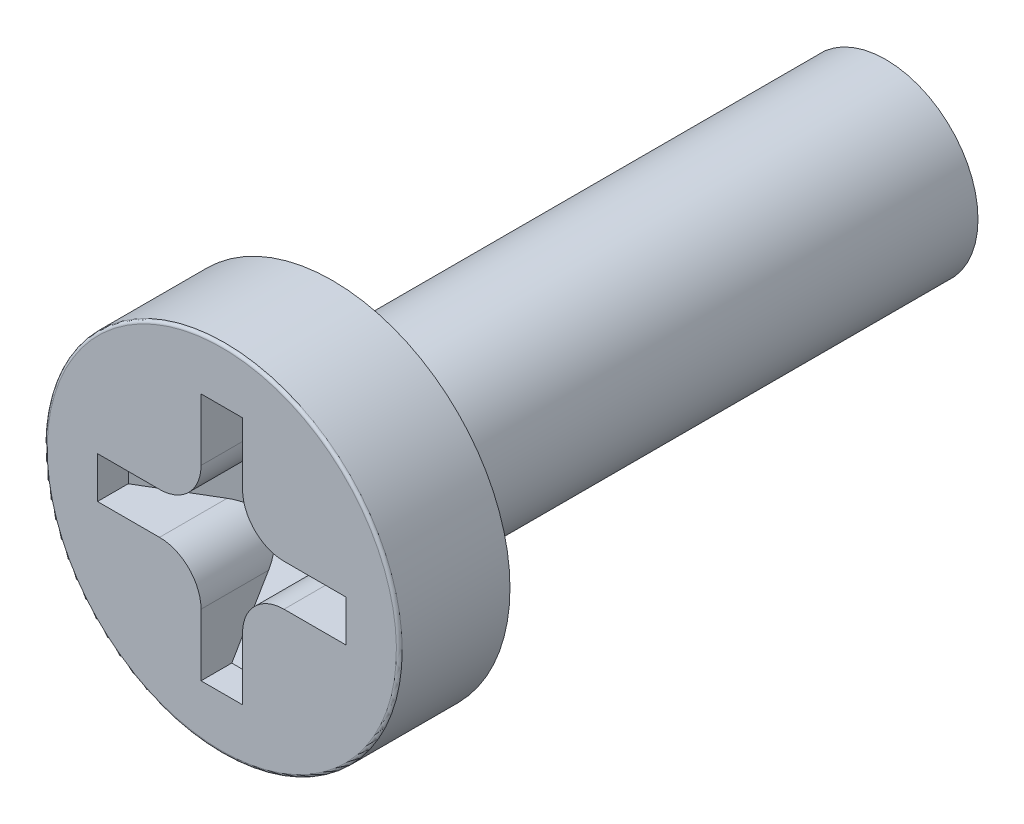
ISO-10303-21;
HEADER;
FILE_DESCRIPTION(('STEP AP214'),'2;1');
FILE_NAME('part.step','',(''),(''),'','','');
FILE_SCHEMA(('AUTOMOTIVE_DESIGN { 1 0 10303 214 1 1 1 1 }'));
ENDSEC;
DATA;
#1=APPLICATION_CONTEXT('core data for automotive mechanical design processes');
#2=APPLICATION_PROTOCOL_DEFINITION('international standard','automotive_design',2000,#1);
#3=PRODUCT_CONTEXT('',#1,'mechanical');
#4=PRODUCT('Part','Part','',(#3));
#5=PRODUCT_RELATED_PRODUCT_CATEGORY('part','',(#4));
#6=PRODUCT_DEFINITION_FORMATION('','',#4);
#7=PRODUCT_DEFINITION_CONTEXT('part definition',#1,'design');
#8=PRODUCT_DEFINITION('design','',#6,#7);
#9=PRODUCT_DEFINITION_SHAPE('','',#8);
#10=(LENGTH_UNIT() NAMED_UNIT(*) SI_UNIT(.MILLI.,.METRE.));
#11=(NAMED_UNIT(*) PLANE_ANGLE_UNIT() SI_UNIT($,.RADIAN.));
#12=(NAMED_UNIT(*) SI_UNIT($,.STERADIAN.) SOLID_ANGLE_UNIT());
#13=UNCERTAINTY_MEASURE_WITH_UNIT(LENGTH_MEASURE(1.E-05),#10,'distance_accuracy_value','');
#14=(GEOMETRIC_REPRESENTATION_CONTEXT(3) GLOBAL_UNCERTAINTY_ASSIGNED_CONTEXT((#13)) GLOBAL_UNIT_ASSIGNED_CONTEXT((#10,
#11,#12)) REPRESENTATION_CONTEXT('',''));
#15=CARTESIAN_POINT('',(0.,0.,0.));
#16=DIRECTION('',(0.,0.,1.));
#17=DIRECTION('',(1.,0.,0.));
#18=AXIS2_PLACEMENT_3D('',#15,#16,#17);
#19=CARTESIAN_POINT('',(0.,0.,0.2));
#20=DIRECTION('',(0.,0.,1.));
#21=DIRECTION('',(1.,0.,0.));
#22=AXIS2_PLACEMENT_3D('',#19,#20,#21);
#23=PLANE('',#22);
#24=DIRECTION('',(0.,1.,0.));
#25=VECTOR('',#24,1.);
#26=CARTESIAN_POINT('',(-0.45,-0.225,0.2));
#27=LINE('',#26,#25);
#28=CARTESIAN_POINT('',(-0.45,-0.285288568297004,0.2));
#29=VERTEX_POINT('',#28);
#30=CARTESIAN_POINT('',(-0.45,0.285288568297004,0.2));
#31=VERTEX_POINT('',#30);
#32=EDGE_CURVE('E303',#29,#31,#27,.T.);
#33=ORIENTED_EDGE('',*,*,#32,.F.);
#34=CARTESIAN_POINT('',(-0.675000000000003,-0.675,0.2));
#35=DIRECTION('',(0.,0.,1.));
#36=DIRECTION('',(1.,0.,0.));
#37=AXIS2_PLACEMENT_3D('',#34,#35,#36);
#38=CIRCLE('',#37,0.45);
#39=CARTESIAN_POINT('',(-0.285288568297005,-0.45,0.2));
#40=VERTEX_POINT('',#39);
#41=EDGE_CURVE('E383',#29,#40,#38,.F.);
#42=ORIENTED_EDGE('',*,*,#41,.T.);
#43=DIRECTION('',(-1.,0.,0.));
#44=VECTOR('',#43,1.);
#45=CARTESIAN_POINT('',(0.224999999999998,-0.45,0.2));
#46=LINE('',#45,#44);
#47=CARTESIAN_POINT('',(0.285288568297,-0.45,0.2));
#48=VERTEX_POINT('',#47);
#49=EDGE_CURVE('E58',#48,#40,#46,.T.);
#50=ORIENTED_EDGE('',*,*,#49,.F.);
#51=CARTESIAN_POINT('',(0.674999999999998,-0.675,0.2));
#52=DIRECTION('',(0.,0.,1.));
#53=DIRECTION('',(1.,0.,0.));
#54=AXIS2_PLACEMENT_3D('',#51,#52,#53);
#55=CIRCLE('',#54,0.45);
#56=CARTESIAN_POINT('',(0.45,-0.285288568297001,0.2));
#57=VERTEX_POINT('',#56);
#58=EDGE_CURVE('E355',#48,#57,#55,.F.);
#59=ORIENTED_EDGE('',*,*,#58,.T.);
#60=DIRECTION('',(0.,1.,0.));
#61=VECTOR('',#60,1.);
#62=CARTESIAN_POINT('',(0.45,-0.225,0.2));
#63=LINE('',#62,#61);
#64=CARTESIAN_POINT('',(0.45,0.285288568297001,0.2));
#65=VERTEX_POINT('',#64);
#66=EDGE_CURVE('E284',#57,#65,#63,.T.);
#67=ORIENTED_EDGE('',*,*,#66,.T.);
#68=CARTESIAN_POINT('',(0.674999999999998,0.675,0.2));
#69=DIRECTION('',(0.,0.,1.));
#70=DIRECTION('',(1.,0.,0.));
#71=AXIS2_PLACEMENT_3D('',#68,#69,#70);
#72=CIRCLE('',#71,0.45);
#73=CARTESIAN_POINT('',(0.285288568297,0.45,0.2));
#74=VERTEX_POINT('',#73);
#75=EDGE_CURVE('E343',#65,#74,#72,.F.);
#76=ORIENTED_EDGE('',*,*,#75,.T.);
#77=DIRECTION('',(-1.,0.,0.));
#78=VECTOR('',#77,1.);
#79=CARTESIAN_POINT('',(0.224999999999998,0.45,0.2));
#80=LINE('',#79,#78);
#81=CARTESIAN_POINT('',(-0.285288568297005,0.45,0.2));
#82=VERTEX_POINT('',#81);
#83=EDGE_CURVE('E273',#74,#82,#80,.T.);
#84=ORIENTED_EDGE('',*,*,#83,.T.);
#85=CARTESIAN_POINT('',(-0.675000000000003,0.675,0.2));
#86=DIRECTION('',(0.,0.,1.));
#87=DIRECTION('',(1.,0.,0.));
#88=AXIS2_PLACEMENT_3D('',#85,#86,#87);
#89=CIRCLE('',#88,0.45);
#90=EDGE_CURVE('E369',#82,#31,#89,.F.);
#91=ORIENTED_EDGE('',*,*,#90,.T.);
#92=EDGE_LOOP('',(#33,#42,#50,#59,#67,#76,#84,#91));
#93=FACE_BOUND('',#92,.T.);
#94=ADVANCED_FACE('F37',(#93),#23,.T.);
#95=CARTESIAN_POINT('',(0.224999999999998,-1.3475,0.2));
#96=DIRECTION('',(1.,0.,0.));
#97=DIRECTION('',(0.,0.,-1.));
#98=AXIS2_PLACEMENT_3D('',#95,#96,#97);
#99=PLANE('',#98);
#100=DIRECTION('',(0.,1.,0.));
#101=VECTOR('',#100,1.);
#102=CARTESIAN_POINT('',(0.224999999999998,-1.3475,1.2));
#103=LINE('',#102,#101);
#104=CARTESIAN_POINT('',(0.224999999999998,-1.3475,1.2));
#105=VERTEX_POINT('',#104);
#106=CARTESIAN_POINT('',(0.224999999999998,-0.675,1.2));
#107=VERTEX_POINT('',#106);
#108=EDGE_CURVE('E238',#105,#107,#103,.T.);
#109=ORIENTED_EDGE('',*,*,#108,.T.);
#110=DIRECTION('',(0.,0.,1.));
#111=VECTOR('',#110,1.);
#112=CARTESIAN_POINT('',(0.224999999999998,-0.675,0.2));
#113=LINE('',#112,#111);
#114=CARTESIAN_POINT('',(0.224999999999998,-0.675,0.467260579064592));
#115=VERTEX_POINT('',#114);
#116=EDGE_CURVE('E325',#107,#115,#113,.F.);
#117=ORIENTED_EDGE('',*,*,#116,.T.);
#118=DIRECTION('',(0.,0.859793442170624,-0.510641984956575));
#119=VECTOR('',#118,1.);
#120=CARTESIAN_POINT('',(0.224999999999998,-0.45,0.333630289532296));
#121=LINE('',#120,#119);
#122=CARTESIAN_POINT('',(0.224999999999998,-1.3475,0.866666666666674));
#123=VERTEX_POINT('',#122);
#124=EDGE_CURVE('E289',#115,#123,#121,.F.);
#125=ORIENTED_EDGE('',*,*,#124,.T.);
#126=DIRECTION('',(0.,0.,1.));
#127=VECTOR('',#126,1.);
#128=CARTESIAN_POINT('',(0.224999999999998,-1.3475,0.2));
#129=LINE('',#128,#127);
#130=EDGE_CURVE('E255',#123,#105,#129,.T.);
#131=ORIENTED_EDGE('',*,*,#130,.T.);
#132=EDGE_LOOP('',(#109,#117,#125,#131));
#133=FACE_BOUND('',#132,.T.);
#134=ADVANCED_FACE('F406',(#133),#99,.F.);
#135=CARTESIAN_POINT('',(-0.225000000000002,-1.3475,0.2));
#136=DIRECTION('',(0.,-1.,0.));
#137=DIRECTION('',(0.,0.,-1.));
#138=AXIS2_PLACEMENT_3D('',#135,#136,#137);
#139=PLANE('',#138);
#140=DIRECTION('',(1.,0.,0.));
#141=VECTOR('',#140,1.);
#142=CARTESIAN_POINT('',(0.224999999999998,-1.3475,0.866666666666674));
#143=LINE('',#142,#141);
#144=CARTESIAN_POINT('',(-0.225000000000002,-1.3475,0.866666666666674));
#145=VERTEX_POINT('',#144);
#146=EDGE_CURVE('E280',#123,#145,#143,.F.);
#147=ORIENTED_EDGE('',*,*,#146,.T.);
#148=DIRECTION('',(0.,0.,1.));
#149=VECTOR('',#148,1.);
#150=CARTESIAN_POINT('',(-0.225000000000002,-1.3475,0.2));
#151=LINE('',#150,#149);
#152=CARTESIAN_POINT('',(-0.225000000000002,-1.3475,1.2));
#153=VERTEX_POINT('',#152);
#154=EDGE_CURVE('E257',#145,#153,#151,.T.);
#155=ORIENTED_EDGE('',*,*,#154,.T.);
#156=DIRECTION('',(1.,0.,0.));
#157=VECTOR('',#156,1.);
#158=CARTESIAN_POINT('',(-0.225000000000002,-1.3475,1.2));
#159=LINE('',#158,#157);
#160=EDGE_CURVE('E235',#153,#105,#159,.T.);
#161=ORIENTED_EDGE('',*,*,#160,.T.);
#162=ORIENTED_EDGE('',*,*,#130,.F.);
#163=EDGE_LOOP('',(#147,#155,#161,#162));
#164=FACE_BOUND('',#163,.T.);
#165=ADVANCED_FACE('F400',(#164),#139,.F.);
#166=CARTESIAN_POINT('',(-0.225000000000002,-0.225,0.2));
#167=DIRECTION('',(-1.,0.,0.));
#168=DIRECTION('',(0.,0.,1.));
#169=AXIS2_PLACEMENT_3D('',#166,#167,#168);
#170=PLANE('',#169);
#171=DIRECTION('',(0.,0.859793442170624,-0.510641984956575));
#172=VECTOR('',#171,1.);
#173=CARTESIAN_POINT('',(-0.225000000000002,-0.225,0.2));
#174=LINE('',#173,#172);
#175=CARTESIAN_POINT('',(-0.225000000000002,-0.675,0.467260579064591));
#176=VERTEX_POINT('',#175);
#177=EDGE_CURVE('E287',#176,#145,#174,.F.);
#178=ORIENTED_EDGE('',*,*,#177,.F.);
#179=DIRECTION('',(0.,0.,1.));
#180=VECTOR('',#179,1.);
#181=CARTESIAN_POINT('',(-0.225000000000002,-0.675,0.2));
#182=LINE('',#181,#180);
#183=CARTESIAN_POINT('',(-0.225000000000002,-0.675,1.2));
#184=VERTEX_POINT('',#183);
#185=EDGE_CURVE('E332',#176,#184,#182,.T.);
#186=ORIENTED_EDGE('',*,*,#185,.T.);
#187=DIRECTION('',(0.,-1.,0.));
#188=VECTOR('',#187,1.);
#189=CARTESIAN_POINT('',(-0.225000000000002,-0.225,1.2));
#190=LINE('',#189,#188);
#191=EDGE_CURVE('E233',#184,#153,#190,.T.);
#192=ORIENTED_EDGE('',*,*,#191,.T.);
#193=ORIENTED_EDGE('',*,*,#154,.F.);
#194=EDGE_LOOP('',(#178,#186,#192,#193));
#195=FACE_BOUND('',#194,.T.);
#196=ADVANCED_FACE('F396',(#195),#170,.F.);
#197=CARTESIAN_POINT('',(1.3475,0.225,0.2));
#198=DIRECTION('',(0.,1.,0.));
#199=DIRECTION('',(0.,0.,1.));
#200=AXIS2_PLACEMENT_3D('',#197,#198,#199);
#201=PLANE('',#200);
#202=DIRECTION('',(-1.,0.,0.));
#203=VECTOR('',#202,1.);
#204=CARTESIAN_POINT('',(1.3475,0.225,1.2));
#205=LINE('',#204,#203);
#206=CARTESIAN_POINT('',(1.3475,0.225,1.2));
#207=VERTEX_POINT('',#206);
#208=CARTESIAN_POINT('',(0.674999999999998,0.225,1.2));
#209=VERTEX_POINT('',#208);
#210=EDGE_CURVE('E246',#207,#209,#205,.T.);
#211=ORIENTED_EDGE('',*,*,#210,.T.);
#212=DIRECTION('',(0.,0.,1.));
#213=VECTOR('',#212,1.);
#214=CARTESIAN_POINT('',(0.674999999999998,0.225,0.2));
#215=LINE('',#214,#213);
#216=CARTESIAN_POINT('',(0.674999999999997,0.225,0.467260579064588));
#217=VERTEX_POINT('',#216);
#218=EDGE_CURVE('E320',#209,#217,#215,.F.);
#219=ORIENTED_EDGE('',*,*,#218,.T.);
#220=DIRECTION('',(0.859793442170624,0.,0.510641984956575));
#221=VECTOR('',#220,1.);
#222=CARTESIAN_POINT('',(1.05480224669156,0.225,0.692829842133077));
#223=LINE('',#222,#221);
#224=CARTESIAN_POINT('',(1.3475,0.225,0.866666666666672));
#225=VERTEX_POINT('',#224);
#226=EDGE_CURVE('E276',#225,#217,#223,.F.);
#227=ORIENTED_EDGE('',*,*,#226,.F.);
#228=DIRECTION('',(0.,0.,1.));
#229=VECTOR('',#228,1.);
#230=CARTESIAN_POINT('',(1.3475,0.225,0.2));
#231=LINE('',#230,#229);
#232=EDGE_CURVE('E249',#225,#207,#231,.T.);
#233=ORIENTED_EDGE('',*,*,#232,.T.);
#234=EDGE_LOOP('',(#211,#219,#227,#233));
#235=FACE_BOUND('',#234,.T.);
#236=ADVANCED_FACE('F435',(#235),#201,.F.);
#237=CARTESIAN_POINT('',(1.3475,-0.225,0.2));
#238=DIRECTION('',(1.,0.,0.));
#239=DIRECTION('',(0.,0.,-1.));
#240=AXIS2_PLACEMENT_3D('',#237,#238,#239);
#241=PLANE('',#240);
#242=DIRECTION('',(0.,-1.,0.));
#243=VECTOR('',#242,1.);
#244=CARTESIAN_POINT('',(1.3475,-0.225,0.866666666666672));
#245=LINE('',#244,#243);
#246=CARTESIAN_POINT('',(1.3475,-0.225,0.866666666666672));
#247=VERTEX_POINT('',#246);
#248=EDGE_CURVE('E281',#247,#225,#245,.F.);
#249=ORIENTED_EDGE('',*,*,#248,.F.);
#250=DIRECTION('',(0.,0.,1.));
#251=VECTOR('',#250,1.);
#252=CARTESIAN_POINT('',(1.3475,-0.225,0.2));
#253=LINE('',#252,#251);
#254=CARTESIAN_POINT('',(1.3475,-0.225,1.2));
#255=VERTEX_POINT('',#254);
#256=EDGE_CURVE('E252',#247,#255,#253,.T.);
#257=ORIENTED_EDGE('',*,*,#256,.T.);
#258=DIRECTION('',(0.,1.,0.));
#259=VECTOR('',#258,1.);
#260=CARTESIAN_POINT('',(1.3475,-0.225,1.2));
#261=LINE('',#260,#259);
#262=EDGE_CURVE('E243',#255,#207,#261,.T.);
#263=ORIENTED_EDGE('',*,*,#262,.T.);
#264=ORIENTED_EDGE('',*,*,#232,.F.);
#265=EDGE_LOOP('',(#249,#257,#263,#264));
#266=FACE_BOUND('',#265,.T.);
#267=ADVANCED_FACE('F445',(#266),#241,.F.);
#268=CARTESIAN_POINT('',(0.224999999999998,-0.225,0.2));
#269=DIRECTION('',(0.,-1.,0.));
#270=DIRECTION('',(0.,0.,-1.));
#271=AXIS2_PLACEMENT_3D('',#268,#269,#270);
#272=PLANE('',#271);
#273=DIRECTION('',(0.859793442170624,0.,0.510641984956575));
#274=VECTOR('',#273,1.);
#275=CARTESIAN_POINT('',(0.45,-0.225,0.333630289532294));
#276=LINE('',#275,#274);
#277=CARTESIAN_POINT('',(0.674999999999998,-0.225,0.467260579064588));
#278=VERTEX_POINT('',#277);
#279=EDGE_CURVE('E279',#247,#278,#276,.F.);
#280=ORIENTED_EDGE('',*,*,#279,.T.);
#281=DIRECTION('',(0.,0.,1.));
#282=VECTOR('',#281,1.);
#283=CARTESIAN_POINT('',(0.674999999999998,-0.225,0.2));
#284=LINE('',#283,#282);
#285=CARTESIAN_POINT('',(0.674999999999998,-0.225,1.2));
#286=VERTEX_POINT('',#285);
#287=EDGE_CURVE('E322',#278,#286,#284,.T.);
#288=ORIENTED_EDGE('',*,*,#287,.T.);
#289=DIRECTION('',(1.,0.,0.));
#290=VECTOR('',#289,1.);
#291=CARTESIAN_POINT('',(0.224999999999998,-0.225,1.2));
#292=LINE('',#291,#290);
#293=EDGE_CURVE('E241',#286,#255,#292,.T.);
#294=ORIENTED_EDGE('',*,*,#293,.T.);
#295=ORIENTED_EDGE('',*,*,#256,.F.);
#296=EDGE_LOOP('',(#280,#288,#294,#295));
#297=FACE_BOUND('',#296,.T.);
#298=ADVANCED_FACE('F448',(#297),#272,.F.);
#299=CARTESIAN_POINT('',(0.224999999999998,0.225,0.2));
#300=DIRECTION('',(1.,0.,0.));
#301=DIRECTION('',(0.,0.,-1.));
#302=AXIS2_PLACEMENT_3D('',#299,#300,#301);
#303=PLANE('',#302);
#304=DIRECTION('',(0.,0.859793442170624,0.510641984956573));
#305=VECTOR('',#304,1.);
#306=CARTESIAN_POINT('',(0.224999999999998,0.45,0.333630289532297));
#307=LINE('',#306,#305);
#308=CARTESIAN_POINT('',(0.224999999999998,1.3475,0.866666666666673));
#309=VERTEX_POINT('',#308);
#310=CARTESIAN_POINT('',(0.224999999999998,0.675,0.467260579064592));
#311=VERTEX_POINT('',#310);
#312=EDGE_CURVE('E269',#309,#311,#307,.F.);
#313=ORIENTED_EDGE('',*,*,#312,.T.);
#314=DIRECTION('',(0.,0.,1.));
#315=VECTOR('',#314,1.);
#316=CARTESIAN_POINT('',(0.224999999999998,0.675,0.2));
#317=LINE('',#316,#315);
#318=CARTESIAN_POINT('',(0.224999999999998,0.675,1.2));
#319=VERTEX_POINT('',#318);
#320=EDGE_CURVE('E310',#311,#319,#317,.T.);
#321=ORIENTED_EDGE('',*,*,#320,.T.);
#322=DIRECTION('',(0.,1.,0.));
#323=VECTOR('',#322,1.);
#324=CARTESIAN_POINT('',(0.224999999999998,0.225,1.2));
#325=LINE('',#324,#323);
#326=CARTESIAN_POINT('',(0.224999999999998,1.3475,1.2));
#327=VERTEX_POINT('',#326);
#328=EDGE_CURVE('E217',#319,#327,#325,.T.);
#329=ORIENTED_EDGE('',*,*,#328,.T.);
#330=DIRECTION('',(0.,0.,1.));
#331=VECTOR('',#330,1.);
#332=CARTESIAN_POINT('',(0.224999999999998,1.3475,0.2));
#333=LINE('',#332,#331);
#334=EDGE_CURVE('E208',#309,#327,#333,.T.);
#335=ORIENTED_EDGE('',*,*,#334,.F.);
#336=EDGE_LOOP('',(#313,#321,#329,#335));
#337=FACE_BOUND('',#336,.T.);
#338=ADVANCED_FACE('F427',(#337),#303,.F.);
#339=CARTESIAN_POINT('',(-0.225000000000002,1.3475,0.2));
#340=DIRECTION('',(-1.,0.,0.));
#341=DIRECTION('',(0.,0.,1.));
#342=AXIS2_PLACEMENT_3D('',#339,#340,#341);
#343=PLANE('',#342);
#344=DIRECTION('',(0.,-1.,0.));
#345=VECTOR('',#344,1.);
#346=CARTESIAN_POINT('',(-0.225000000000002,1.3475,1.2));
#347=LINE('',#346,#345);
#348=CARTESIAN_POINT('',(-0.225000000000002,1.3475,1.2));
#349=VERTEX_POINT('',#348);
#350=CARTESIAN_POINT('',(-0.225000000000002,0.675,1.2));
#351=VERTEX_POINT('',#350);
#352=EDGE_CURVE('E201',#349,#351,#347,.T.);
#353=ORIENTED_EDGE('',*,*,#352,.T.);
#354=DIRECTION('',(0.,0.,1.));
#355=VECTOR('',#354,1.);
#356=CARTESIAN_POINT('',(-0.225000000000002,0.675,0.2));
#357=LINE('',#356,#355);
#358=CARTESIAN_POINT('',(-0.225000000000002,0.675,0.467260579064592));
#359=VERTEX_POINT('',#358);
#360=EDGE_CURVE('E330',#351,#359,#357,.F.);
#361=ORIENTED_EDGE('',*,*,#360,.T.);
#362=DIRECTION('',(0.,0.859793442170624,0.510641984956573));
#363=VECTOR('',#362,1.);
#364=CARTESIAN_POINT('',(-0.225000000000002,1.05480224669156,0.692829842133079));
#365=LINE('',#364,#363);
#366=CARTESIAN_POINT('',(-0.225000000000002,1.3475,0.866666666666673));
#367=VERTEX_POINT('',#366);
#368=EDGE_CURVE('E204',#367,#359,#365,.F.);
#369=ORIENTED_EDGE('',*,*,#368,.F.);
#370=DIRECTION('',(0.,0.,1.));
#371=VECTOR('',#370,1.);
#372=CARTESIAN_POINT('',(-0.225000000000002,1.3475,0.2));
#373=LINE('',#372,#371);
#374=EDGE_CURVE('E197',#367,#349,#373,.T.);
#375=ORIENTED_EDGE('',*,*,#374,.T.);
#376=EDGE_LOOP('',(#353,#361,#369,#375));
#377=FACE_BOUND('',#376,.T.);
#378=ADVANCED_FACE('F199',(#377),#343,.F.);
#379=CARTESIAN_POINT('',(0.224999999999998,1.3475,0.2));
#380=DIRECTION('',(0.,1.,0.));
#381=DIRECTION('',(0.,0.,1.));
#382=AXIS2_PLACEMENT_3D('',#379,#380,#381);
#383=PLANE('',#382);
#384=DIRECTION('',(1.,0.,0.));
#385=VECTOR('',#384,1.);
#386=CARTESIAN_POINT('',(0.224999999999998,1.3475,0.866666666666673));
#387=LINE('',#386,#385);
#388=EDGE_CURVE('E271',#309,#367,#387,.F.);
#389=ORIENTED_EDGE('',*,*,#388,.F.);
#390=ORIENTED_EDGE('',*,*,#334,.T.);
#391=DIRECTION('',(-1.,0.,0.));
#392=VECTOR('',#391,1.);
#393=CARTESIAN_POINT('',(0.224999999999998,1.3475,1.2));
#394=LINE('',#393,#392);
#395=EDGE_CURVE('E212',#327,#349,#394,.T.);
#396=ORIENTED_EDGE('',*,*,#395,.T.);
#397=ORIENTED_EDGE('',*,*,#374,.F.);
#398=EDGE_LOOP('',(#389,#390,#396,#397));
#399=FACE_BOUND('',#398,.T.);
#400=ADVANCED_FACE('F213',(#399),#383,.F.);
#401=CARTESIAN_POINT('',(-1.3475,-0.225,0.2));
#402=DIRECTION('',(0.,-1.,0.));
#403=DIRECTION('',(0.,0.,-1.));
#404=AXIS2_PLACEMENT_3D('',#401,#402,#403);
#405=PLANE('',#404);
#406=DIRECTION('',(1.,0.,0.));
#407=VECTOR('',#406,1.);
#408=CARTESIAN_POINT('',(-1.3475,-0.225,1.2));
#409=LINE('',#408,#407);
#410=CARTESIAN_POINT('',(-1.3475,-0.225,1.2));
#411=VERTEX_POINT('',#410);
#412=CARTESIAN_POINT('',(-0.675000000000003,-0.225,1.2));
#413=VERTEX_POINT('',#412);
#414=EDGE_CURVE('E230',#411,#413,#409,.T.);
#415=ORIENTED_EDGE('',*,*,#414,.T.);
#416=DIRECTION('',(0.,0.,1.));
#417=VECTOR('',#416,1.);
#418=CARTESIAN_POINT('',(-0.675000000000003,-0.225,0.2));
#419=LINE('',#418,#417);
#420=CARTESIAN_POINT('',(-0.675000000000003,-0.225,0.467260579064591));
#421=VERTEX_POINT('',#420);
#422=EDGE_CURVE('E335',#413,#421,#419,.F.);
#423=ORIENTED_EDGE('',*,*,#422,.T.);
#424=DIRECTION('',(0.859793442170624,0.,-0.510641984956573));
#425=VECTOR('',#424,1.);
#426=CARTESIAN_POINT('',(-0.45,-0.225,0.333630289532294));
#427=LINE('',#426,#425);
#428=CARTESIAN_POINT('',(-1.3475,-0.225,0.86666666666667));
#429=VERTEX_POINT('',#428);
#430=EDGE_CURVE('E296',#421,#429,#427,.F.);
#431=ORIENTED_EDGE('',*,*,#430,.T.);
#432=DIRECTION('',(0.,0.,1.));
#433=VECTOR('',#432,1.);
#434=CARTESIAN_POINT('',(-1.3475,-0.225,0.2));
#435=LINE('',#434,#433);
#436=EDGE_CURVE('E260',#429,#411,#435,.T.);
#437=ORIENTED_EDGE('',*,*,#436,.T.);
#438=EDGE_LOOP('',(#415,#423,#431,#437));
#439=FACE_BOUND('',#438,.T.);
#440=ADVANCED_FACE('F477',(#439),#405,.F.);
#441=CARTESIAN_POINT('',(-1.3475,0.225,0.2));
#442=DIRECTION('',(-1.,0.,0.));
#443=DIRECTION('',(0.,0.,1.));
#444=AXIS2_PLACEMENT_3D('',#441,#442,#443);
#445=PLANE('',#444);
#446=DIRECTION('',(0.,-1.,0.));
#447=VECTOR('',#446,1.);
#448=CARTESIAN_POINT('',(-1.3475,-0.225,0.866666666666671));
#449=LINE('',#448,#447);
#450=CARTESIAN_POINT('',(-1.3475,0.225,0.86666666666667));
#451=VERTEX_POINT('',#450);
#452=EDGE_CURVE('E300',#429,#451,#449,.F.);
#453=ORIENTED_EDGE('',*,*,#452,.T.);
#454=DIRECTION('',(0.,0.,1.));
#455=VECTOR('',#454,1.);
#456=CARTESIAN_POINT('',(-1.3475,0.225,0.2));
#457=LINE('',#456,#455);
#458=CARTESIAN_POINT('',(-1.3475,0.225,1.2));
#459=VERTEX_POINT('',#458);
#460=EDGE_CURVE('E207',#451,#459,#457,.T.);
#461=ORIENTED_EDGE('',*,*,#460,.T.);
#462=DIRECTION('',(0.,-1.,0.));
#463=VECTOR('',#462,1.);
#464=CARTESIAN_POINT('',(-1.3475,0.225,1.2));
#465=LINE('',#464,#463);
#466=EDGE_CURVE('E224',#459,#411,#465,.T.);
#467=ORIENTED_EDGE('',*,*,#466,.T.);
#468=ORIENTED_EDGE('',*,*,#436,.F.);
#469=EDGE_LOOP('',(#453,#461,#467,#468));
#470=FACE_BOUND('',#469,.T.);
#471=ADVANCED_FACE('F480',(#470),#445,.F.);
#472=CARTESIAN_POINT('',(-0.225000000000002,0.225,0.2));
#473=DIRECTION('',(0.,1.,0.));
#474=DIRECTION('',(0.,0.,1.));
#475=AXIS2_PLACEMENT_3D('',#472,#473,#474);
#476=PLANE('',#475);
#477=DIRECTION('',(0.859793442170624,0.,-0.510641984956573));
#478=VECTOR('',#477,1.);
#479=CARTESIAN_POINT('',(-0.225000000000002,0.225,0.2));
#480=LINE('',#479,#478);
#481=CARTESIAN_POINT('',(-0.675000000000003,0.225,0.46726057906459));
#482=VERTEX_POINT('',#481);
#483=EDGE_CURVE('E294',#482,#451,#480,.F.);
#484=ORIENTED_EDGE('',*,*,#483,.F.);
#485=DIRECTION('',(0.,0.,1.));
#486=VECTOR('',#485,1.);
#487=CARTESIAN_POINT('',(-0.675000000000003,0.225,0.2));
#488=LINE('',#487,#486);
#489=CARTESIAN_POINT('',(-0.675000000000003,0.225,1.2));
#490=VERTEX_POINT('',#489);
#491=EDGE_CURVE('E327',#482,#490,#488,.T.);
#492=ORIENTED_EDGE('',*,*,#491,.T.);
#493=DIRECTION('',(-1.,0.,0.));
#494=VECTOR('',#493,1.);
#495=CARTESIAN_POINT('',(-0.225000000000002,0.225,1.2));
#496=LINE('',#495,#494);
#497=EDGE_CURVE('E222',#490,#459,#496,.T.);
#498=ORIENTED_EDGE('',*,*,#497,.T.);
#499=ORIENTED_EDGE('',*,*,#460,.F.);
#500=EDGE_LOOP('',(#484,#492,#498,#499));
#501=FACE_BOUND('',#500,.T.);
#502=ADVANCED_FACE('F484',(#501),#476,.F.);
#503=CARTESIAN_POINT('',(0.,0.,1.2));
#504=DIRECTION('',(0.,0.,-1.));
#505=DIRECTION('',(0.,1.,0.));
#506=AXIS2_PLACEMENT_3D('',#503,#504,#505);
#507=CYLINDRICAL_SURFACE('',#506,1.92499999999995);
#508=CARTESIAN_POINT('',(0.,0.,1.16850393700787));
#509=DIRECTION('',(0.,0.,1.));
#510=DIRECTION('',(0.,-1.,0.));
#511=AXIS2_PLACEMENT_3D('',#508,#509,#510);
#512=CIRCLE('',#511,1.92499999999995);
#513=CARTESIAN_POINT('',(0.,-1.92499999999995,1.16850393700787));
#514=VERTEX_POINT('',#513);
#515=EDGE_CURVE('E304',#514,#514,#512,.F.);
#516=ORIENTED_EDGE('',*,*,#515,.T.);
#517=EDGE_LOOP('',(#516));
#518=FACE_BOUND('',#517,.T.);
#519=CARTESIAN_POINT('',(0.,0.,0.));
#520=DIRECTION('',(0.,0.,-1.));
#521=DIRECTION('',(0.,1.,0.));
#522=AXIS2_PLACEMENT_3D('',#519,#520,#521);
#523=CIRCLE('',#522,1.92499999999995);
#524=CARTESIAN_POINT('',(0.,1.92499999999995,0.));
#525=VERTEX_POINT('',#524);
#526=EDGE_CURVE('E251',#525,#525,#523,.T.);
#527=ORIENTED_EDGE('',*,*,#526,.F.);
#528=EDGE_LOOP('',(#527));
#529=FACE_BOUND('',#528,.T.);
#530=ADVANCED_FACE('F488',(#518,#529),#507,.T.);
#531=CARTESIAN_POINT('',(1.92499999999995,0.,1.2));
#532=DIRECTION('',(0.,0.,1.));
#533=DIRECTION('',(0.,-1.,0.));
#534=AXIS2_PLACEMENT_3D('',#531,#532,#533);
#535=PLANE('',#534);
#536=CARTESIAN_POINT('',(0.,0.,1.2));
#537=DIRECTION('',(0.,0.,1.));
#538=DIRECTION('',(0.,-1.,0.));
#539=AXIS2_PLACEMENT_3D('',#536,#537,#538);
#540=CIRCLE('',#539,1.89350393700783);
#541=CARTESIAN_POINT('',(0.,-1.89350393700783,1.2));
#542=VERTEX_POINT('',#541);
#543=EDGE_CURVE('E307',#542,#542,#540,.T.);
#544=ORIENTED_EDGE('',*,*,#543,.T.);
#545=EDGE_LOOP('',(#544));
#546=FACE_BOUND('',#545,.T.);
#547=ORIENTED_EDGE('',*,*,#328,.F.);
#548=CARTESIAN_POINT('',(0.674999999999998,0.675,1.2));
#549=DIRECTION('',(0.,0.,1.));
#550=DIRECTION('',(0.,-1.,0.));
#551=AXIS2_PLACEMENT_3D('',#548,#549,#550);
#552=CIRCLE('',#551,0.45);
#553=EDGE_CURVE('E318',#319,#209,#552,.T.);
#554=ORIENTED_EDGE('',*,*,#553,.T.);
#555=ORIENTED_EDGE('',*,*,#210,.F.);
#556=ORIENTED_EDGE('',*,*,#262,.F.);
#557=ORIENTED_EDGE('',*,*,#293,.F.);
#558=CARTESIAN_POINT('',(0.674999999999998,-0.675,1.2));
#559=DIRECTION('',(0.,0.,1.));
#560=DIRECTION('',(0.,-1.,0.));
#561=AXIS2_PLACEMENT_3D('',#558,#559,#560);
#562=CIRCLE('',#561,0.45);
#563=EDGE_CURVE('E316',#286,#107,#562,.T.);
#564=ORIENTED_EDGE('',*,*,#563,.T.);
#565=ORIENTED_EDGE('',*,*,#108,.F.);
#566=ORIENTED_EDGE('',*,*,#160,.F.);
#567=ORIENTED_EDGE('',*,*,#191,.F.);
#568=CARTESIAN_POINT('',(-0.675000000000003,-0.675,1.2));
#569=DIRECTION('',(0.,0.,1.));
#570=DIRECTION('',(0.,-1.,0.));
#571=AXIS2_PLACEMENT_3D('',#568,#569,#570);
#572=CIRCLE('',#571,0.45);
#573=EDGE_CURVE('E313',#184,#413,#572,.T.);
#574=ORIENTED_EDGE('',*,*,#573,.T.);
#575=ORIENTED_EDGE('',*,*,#414,.F.);
#576=ORIENTED_EDGE('',*,*,#466,.F.);
#577=ORIENTED_EDGE('',*,*,#497,.F.);
#578=CARTESIAN_POINT('',(-0.675000000000003,0.675,1.2));
#579=DIRECTION('',(0.,0.,1.));
#580=DIRECTION('',(0.,-1.,0.));
#581=AXIS2_PLACEMENT_3D('',#578,#579,#580);
#582=CIRCLE('',#581,0.45);
#583=EDGE_CURVE('E221',#490,#351,#582,.T.);
#584=ORIENTED_EDGE('',*,*,#583,.T.);
#585=ORIENTED_EDGE('',*,*,#352,.F.);
#586=ORIENTED_EDGE('',*,*,#395,.F.);
#587=EDGE_LOOP('',(#547,#554,#555,#556,#557,#564,#565,#566,#567,#574,#575,#576,#577,#584,#585,#586));
#588=FACE_BOUND('',#587,.T.);
#589=ADVANCED_FACE('F219',(#546,#588),#535,.T.);
#590=CARTESIAN_POINT('',(0.,0.,0.));
#591=DIRECTION('',(0.,0.,-1.));
#592=DIRECTION('',(0.,1.,0.));
#593=AXIS2_PLACEMENT_3D('',#590,#591,#592);
#594=PLANE('',#593);
#595=CARTESIAN_POINT('',(0.,0.,0.));
#596=DIRECTION('',(0.,0.,-1.));
#597=DIRECTION('',(0.,1.,0.));
#598=AXIS2_PLACEMENT_3D('',#595,#596,#597);
#599=CIRCLE('',#598,0.99999999999989);
#600=CARTESIAN_POINT('',(0.,0.99999999999989,0.));
#601=VERTEX_POINT('',#600);
#602=EDGE_CURVE('E267',#601,#601,#599,.T.);
#603=ORIENTED_EDGE('',*,*,#602,.F.);
#604=EDGE_LOOP('',(#603));
#605=FACE_BOUND('',#604,.T.);
#606=ORIENTED_EDGE('',*,*,#526,.T.);
#607=EDGE_LOOP('',(#606));
#608=FACE_BOUND('',#607,.T.);
#609=ADVANCED_FACE('F494',(#605,#608),#594,.T.);
#610=CARTESIAN_POINT('',(-0.45,-0.225,0.333630289532294));
#611=DIRECTION('',(0.510641984956573,0.,0.859793442170624));
#612=DIRECTION('',(0.859793442170624,0.,-0.510641984956573));
#613=AXIS2_PLACEMENT_3D('',#610,#611,#612);
#614=PLANE('',#613);
#615=DIRECTION('',(0.,1.,0.));
#616=VECTOR('',#615,1.);
#617=CARTESIAN_POINT('',(-0.45,-0.225,0.333630289532294));
#618=LINE('',#617,#616);
#619=CARTESIAN_POINT('',(-0.45,-0.285288568297004,0.333630289532294));
#620=VERTEX_POINT('',#619);
#621=CARTESIAN_POINT('',(-0.45,0.285288568297004,0.333630289532294));
#622=VERTEX_POINT('',#621);
#623=EDGE_CURVE('E299',#620,#622,#618,.T.);
#624=ORIENTED_EDGE('',*,*,#623,.T.);
#625=CARTESIAN_POINT('',(-0.675000000000003,0.675,0.467260579064591));
#626=DIRECTION('',(0.510641984956573,0.,0.859793442170624));
#627=DIRECTION('',(-0.859793442170624,0.,0.510641984956573));
#628=AXIS2_PLACEMENT_3D('',#625,#626,#627);
#629=ELLIPSE('',#628,0.523381521570966,0.45);
#630=EDGE_CURVE('E375',#622,#482,#629,.F.);
#631=ORIENTED_EDGE('',*,*,#630,.T.);
#632=ORIENTED_EDGE('',*,*,#483,.T.);
#633=ORIENTED_EDGE('',*,*,#452,.F.);
#634=ORIENTED_EDGE('',*,*,#430,.F.);
#635=CARTESIAN_POINT('',(-0.675000000000003,-0.675,0.467260579064591));
#636=DIRECTION('',(0.510641984956573,0.,0.859793442170624));
#637=DIRECTION('',(-0.859793442170624,0.,0.510641984956573));
#638=AXIS2_PLACEMENT_3D('',#635,#636,#637);
#639=ELLIPSE('',#638,0.523381521570966,0.45);
#640=EDGE_CURVE('E377',#421,#620,#639,.F.);
#641=ORIENTED_EDGE('',*,*,#640,.T.);
#642=EDGE_LOOP('',(#624,#631,#632,#633,#634,#641));
#643=FACE_BOUND('',#642,.T.);
#644=ADVANCED_FACE('F497',(#643),#614,.T.);
#645=CARTESIAN_POINT('',(-0.45,-0.225,0.333630289532294));
#646=DIRECTION('',(-1.,0.,0.));
#647=DIRECTION('',(0.,0.,1.));
#648=AXIS2_PLACEMENT_3D('',#645,#646,#647);
#649=PLANE('',#648);
#650=ORIENTED_EDGE('',*,*,#32,.T.);
#651=DIRECTION('',(0.,0.,1.));
#652=VECTOR('',#651,1.);
#653=CARTESIAN_POINT('',(-0.45,0.285288568297004,0.2));
#654=LINE('',#653,#652);
#655=EDGE_CURVE('E372',#31,#622,#654,.T.);
#656=ORIENTED_EDGE('',*,*,#655,.T.);
#657=ORIENTED_EDGE('',*,*,#623,.F.);
#658=DIRECTION('',(0.,0.,1.));
#659=VECTOR('',#658,1.);
#660=CARTESIAN_POINT('',(-0.45,-0.285288568297004,0.333630289532294));
#661=LINE('',#660,#659);
#662=EDGE_CURVE('E380',#620,#29,#661,.F.);
#663=ORIENTED_EDGE('',*,*,#662,.T.);
#664=EDGE_LOOP('',(#650,#656,#657,#663));
#665=FACE_BOUND('',#664,.T.);
#666=ADVANCED_FACE('F465',(#665),#649,.F.);
#667=CARTESIAN_POINT('',(0.224999999999998,0.45,0.333630289532297));
#668=DIRECTION('',(0.,-0.510641984956573,0.859793442170624));
#669=DIRECTION('',(0.,-0.859793442170624,-0.510641984956573));
#670=AXIS2_PLACEMENT_3D('',#667,#668,#669);
#671=PLANE('',#670);
#672=ORIENTED_EDGE('',*,*,#368,.T.);
#673=CARTESIAN_POINT('',(-0.675000000000003,0.675,0.467260579064592));
#674=DIRECTION('',(0.,-0.510641984956573,0.859793442170624));
#675=DIRECTION('',(0.,0.859793442170624,0.510641984956573));
#676=AXIS2_PLACEMENT_3D('',#673,#674,#675);
#677=ELLIPSE('',#676,0.523381521570966,0.45);
#678=CARTESIAN_POINT('',(-0.285288568297005,0.45,0.333630289532297));
#679=VERTEX_POINT('',#678);
#680=EDGE_CURVE('E363',#359,#679,#677,.F.);
#681=ORIENTED_EDGE('',*,*,#680,.T.);
#682=DIRECTION('',(-1.,0.,0.));
#683=VECTOR('',#682,1.);
#684=CARTESIAN_POINT('',(0.224999999999998,0.45,0.333630289532297));
#685=LINE('',#684,#683);
#686=CARTESIAN_POINT('',(0.285288568297,0.45,0.333630289532297));
#687=VERTEX_POINT('',#686);
#688=EDGE_CURVE('E297',#687,#679,#685,.T.);
#689=ORIENTED_EDGE('',*,*,#688,.F.);
#690=CARTESIAN_POINT('',(0.674999999999998,0.675,0.467260579064592));
#691=DIRECTION('',(0.,-0.510641984956573,0.859793442170624));
#692=DIRECTION('',(0.,0.859793442170624,0.510641984956573));
#693=AXIS2_PLACEMENT_3D('',#690,#691,#692);
#694=ELLIPSE('',#693,0.523381521570966,0.45);
#695=EDGE_CURVE('E349',#687,#311,#694,.F.);
#696=ORIENTED_EDGE('',*,*,#695,.T.);
#697=ORIENTED_EDGE('',*,*,#312,.F.);
#698=ORIENTED_EDGE('',*,*,#388,.T.);
#699=EDGE_LOOP('',(#672,#681,#689,#696,#697,#698));
#700=FACE_BOUND('',#699,.T.);
#701=ADVANCED_FACE('F505',(#700),#671,.T.);
#702=CARTESIAN_POINT('',(0.224999999999998,0.45,0.2));
#703=DIRECTION('',(0.,1.,0.));
#704=DIRECTION('',(0.,0.,1.));
#705=AXIS2_PLACEMENT_3D('',#702,#703,#704);
#706=PLANE('',#705);
#707=ORIENTED_EDGE('',*,*,#688,.T.);
#708=DIRECTION('',(0.,0.,1.));
#709=VECTOR('',#708,1.);
#710=CARTESIAN_POINT('',(-0.285288568297005,0.45,0.333630289532297));
#711=LINE('',#710,#709);
#712=EDGE_CURVE('E366',#679,#82,#711,.F.);
#713=ORIENTED_EDGE('',*,*,#712,.T.);
#714=ORIENTED_EDGE('',*,*,#83,.F.);
#715=DIRECTION('',(0.,0.,1.));
#716=VECTOR('',#715,1.);
#717=CARTESIAN_POINT('',(0.285288568297,0.45,0.2));
#718=LINE('',#717,#716);
#719=EDGE_CURVE('E346',#74,#687,#718,.T.);
#720=ORIENTED_EDGE('',*,*,#719,.T.);
#721=EDGE_LOOP('',(#707,#713,#714,#720));
#722=FACE_BOUND('',#721,.T.);
#723=ADVANCED_FACE('F508',(#722),#706,.F.);
#724=CARTESIAN_POINT('',(0.45,-0.225,0.333630289532294));
#725=DIRECTION('',(-0.510641984956575,0.,0.859793442170624));
#726=DIRECTION('',(0.859793442170624,0.,0.510641984956575));
#727=AXIS2_PLACEMENT_3D('',#724,#725,#726);
#728=PLANE('',#727);
#729=ORIENTED_EDGE('',*,*,#226,.T.);
#730=CARTESIAN_POINT('',(0.674999999999998,0.675,0.467260579064588));
#731=DIRECTION('',(-0.510641984956575,0.,0.859793442170624));
#732=DIRECTION('',(0.859793442170624,0.,0.510641984956575));
#733=AXIS2_PLACEMENT_3D('',#730,#731,#732);
#734=ELLIPSE('',#733,0.523381521570967,0.45);
#735=CARTESIAN_POINT('',(0.45,0.285288568297001,0.333630289532294));
#736=VERTEX_POINT('',#735);
#737=EDGE_CURVE('E337',#217,#736,#734,.F.);
#738=ORIENTED_EDGE('',*,*,#737,.T.);
#739=DIRECTION('',(0.,1.,0.));
#740=VECTOR('',#739,1.);
#741=CARTESIAN_POINT('',(0.45,-0.225,0.333630289532294));
#742=LINE('',#741,#740);
#743=CARTESIAN_POINT('',(0.45,-0.285288568297001,0.333630289532294));
#744=VERTEX_POINT('',#743);
#745=EDGE_CURVE('E270',#744,#736,#742,.T.);
#746=ORIENTED_EDGE('',*,*,#745,.F.);
#747=CARTESIAN_POINT('',(0.674999999999998,-0.675,0.467260579064588));
#748=DIRECTION('',(-0.510641984956575,0.,0.859793442170624));
#749=DIRECTION('',(0.859793442170624,0.,0.510641984956575));
#750=AXIS2_PLACEMENT_3D('',#747,#748,#749);
#751=ELLIPSE('',#750,0.523381521570967,0.45);
#752=EDGE_CURVE('E361',#744,#278,#751,.F.);
#753=ORIENTED_EDGE('',*,*,#752,.T.);
#754=ORIENTED_EDGE('',*,*,#279,.F.);
#755=ORIENTED_EDGE('',*,*,#248,.T.);
#756=EDGE_LOOP('',(#729,#738,#746,#753,#754,#755));
#757=FACE_BOUND('',#756,.T.);
#758=ADVANCED_FACE('F442',(#757),#728,.T.);
#759=CARTESIAN_POINT('',(0.45,-0.225,0.2));
#760=DIRECTION('',(1.,0.,0.));
#761=DIRECTION('',(0.,0.,-1.));
#762=AXIS2_PLACEMENT_3D('',#759,#760,#761);
#763=PLANE('',#762);
#764=ORIENTED_EDGE('',*,*,#745,.T.);
#765=DIRECTION('',(0.,0.,1.));
#766=VECTOR('',#765,1.);
#767=CARTESIAN_POINT('',(0.45,0.285288568297001,0.333630289532294));
#768=LINE('',#767,#766);
#769=EDGE_CURVE('E340',#736,#65,#768,.F.);
#770=ORIENTED_EDGE('',*,*,#769,.T.);
#771=ORIENTED_EDGE('',*,*,#66,.F.);
#772=DIRECTION('',(0.,0.,1.));
#773=VECTOR('',#772,1.);
#774=CARTESIAN_POINT('',(0.45,-0.285288568297001,0.2));
#775=LINE('',#774,#773);
#776=EDGE_CURVE('E358',#57,#744,#775,.T.);
#777=ORIENTED_EDGE('',*,*,#776,.T.);
#778=EDGE_LOOP('',(#764,#770,#771,#777));
#779=FACE_BOUND('',#778,.T.);
#780=ADVANCED_FACE('F512',(#779),#763,.F.);
#781=CARTESIAN_POINT('',(0.224999999999998,-0.45,0.333630289532296));
#782=DIRECTION('',(0.,0.510641984956575,0.859793442170624));
#783=DIRECTION('',(0.,-0.859793442170624,0.510641984956575));
#784=AXIS2_PLACEMENT_3D('',#781,#782,#783);
#785=PLANE('',#784);
#786=DIRECTION('',(-1.,0.,0.));
#787=VECTOR('',#786,1.);
#788=CARTESIAN_POINT('',(0.224999999999998,-0.45,0.333630289532296));
#789=LINE('',#788,#787);
#790=CARTESIAN_POINT('',(0.285288568297,-0.45,0.333630289532296));
#791=VERTEX_POINT('',#790);
#792=CARTESIAN_POINT('',(-0.285288568297005,-0.45,0.333630289532296));
#793=VERTEX_POINT('',#792);
#794=EDGE_CURVE('E51',#791,#793,#789,.T.);
#795=ORIENTED_EDGE('',*,*,#794,.T.);
#796=CARTESIAN_POINT('',(-0.675000000000003,-0.675,0.467260579064592));
#797=DIRECTION('',(0.,0.510641984956575,0.859793442170624));
#798=DIRECTION('',(0.,-0.859793442170624,0.510641984956575));
#799=AXIS2_PLACEMENT_3D('',#796,#797,#798);
#800=ELLIPSE('',#799,0.523381521570967,0.45);
#801=EDGE_CURVE('E11',#793,#176,#800,.F.);
#802=ORIENTED_EDGE('',*,*,#801,.T.);
#803=ORIENTED_EDGE('',*,*,#177,.T.);
#804=ORIENTED_EDGE('',*,*,#146,.F.);
#805=ORIENTED_EDGE('',*,*,#124,.F.);
#806=CARTESIAN_POINT('',(0.674999999999998,-0.675,0.467260579064592));
#807=DIRECTION('',(0.,0.510641984956575,0.859793442170624));
#808=DIRECTION('',(0.,-0.859793442170624,0.510641984956575));
#809=AXIS2_PLACEMENT_3D('',#806,#807,#808);
#810=ELLIPSE('',#809,0.523381521570967,0.45);
#811=EDGE_CURVE('E351',#115,#791,#810,.F.);
#812=ORIENTED_EDGE('',*,*,#811,.T.);
#813=EDGE_LOOP('',(#795,#802,#803,#804,#805,#812));
#814=FACE_BOUND('',#813,.T.);
#815=ADVANCED_FACE('F392',(#814),#785,.T.);
#816=CARTESIAN_POINT('',(0.224999999999998,-0.45,0.333630289532296));
#817=DIRECTION('',(0.,-1.,0.));
#818=DIRECTION('',(0.,0.,-1.));
#819=AXIS2_PLACEMENT_3D('',#816,#817,#818);
#820=PLANE('',#819);
#821=ORIENTED_EDGE('',*,*,#49,.T.);
#822=DIRECTION('',(0.,0.,1.));
#823=VECTOR('',#822,1.);
#824=CARTESIAN_POINT('',(-0.285288568297005,-0.45,0.2));
#825=LINE('',#824,#823);
#826=EDGE_CURVE('E45',#40,#793,#825,.T.);
#827=ORIENTED_EDGE('',*,*,#826,.T.);
#828=ORIENTED_EDGE('',*,*,#794,.F.);
#829=DIRECTION('',(0.,0.,1.));
#830=VECTOR('',#829,1.);
#831=CARTESIAN_POINT('',(0.285288568297,-0.45,0.333630289532296));
#832=LINE('',#831,#830);
#833=EDGE_CURVE('E353',#791,#48,#832,.F.);
#834=ORIENTED_EDGE('',*,*,#833,.T.);
#835=EDGE_LOOP('',(#821,#827,#828,#834));
#836=FACE_BOUND('',#835,.T.);
#837=ADVANCED_FACE('F386',(#836),#820,.F.);
#838=CARTESIAN_POINT('',(0.,0.,-6.));
#839=DIRECTION('',(0.,0.,1.));
#840=DIRECTION('',(0.,-1.,0.));
#841=AXIS2_PLACEMENT_3D('',#838,#839,#840);
#842=CYLINDRICAL_SURFACE('',#841,0.99999999999989);
#843=CARTESIAN_POINT('',(0.,0.,-6.));
#844=DIRECTION('',(0.,0.,-1.));
#845=DIRECTION('',(0.,1.,0.));
#846=AXIS2_PLACEMENT_3D('',#843,#844,#845);
#847=CIRCLE('',#846,0.99999999999989);
#848=CARTESIAN_POINT('',(0.,0.99999999999989,-6.));
#849=VERTEX_POINT('',#848);
#850=EDGE_CURVE('E290',#849,#849,#847,.T.);
#851=ORIENTED_EDGE('',*,*,#850,.F.);
#852=EDGE_LOOP('',(#851));
#853=FACE_BOUND('',#852,.T.);
#854=ORIENTED_EDGE('',*,*,#602,.T.);
#855=EDGE_LOOP('',(#854));
#856=FACE_BOUND('',#855,.T.);
#857=ADVANCED_FACE('F586',(#853,#856),#842,.T.);
#858=CARTESIAN_POINT('',(0.,0.,-6.));
#859=DIRECTION('',(0.,0.,-1.));
#860=DIRECTION('',(0.,1.,0.));
#861=AXIS2_PLACEMENT_3D('',#858,#859,#860);
#862=PLANE('',#861);
#863=ORIENTED_EDGE('',*,*,#850,.T.);
#864=EDGE_LOOP('',(#863));
#865=FACE_BOUND('',#864,.T.);
#866=ADVANCED_FACE('F521',(#865),#862,.T.);
#867=CARTESIAN_POINT('',(0.,0.,1.16850393700787));
#868=DIRECTION('',(0.,0.,1.));
#869=DIRECTION('',(0.,-1.,0.));
#870=AXIS2_PLACEMENT_3D('',#867,#868,#869);
#871=TOROIDAL_SURFACE('',#870,1.89350393700783,0.031496062992126);
#872=ORIENTED_EDGE('',*,*,#543,.F.);
#873=EDGE_LOOP('',(#872));
#874=FACE_BOUND('',#873,.T.);
#875=ORIENTED_EDGE('',*,*,#515,.F.);
#876=EDGE_LOOP('',(#875));
#877=FACE_BOUND('',#876,.T.);
#878=ADVANCED_FACE('F518',(#874,#877),#871,.T.);
#879=CARTESIAN_POINT('',(0.674999999999998,0.675,0.2));
#880=DIRECTION('',(0.,0.,1.));
#881=DIRECTION('',(1.,0.,0.));
#882=AXIS2_PLACEMENT_3D('',#879,#880,#881);
#883=CYLINDRICAL_SURFACE('',#882,0.45);
#884=ORIENTED_EDGE('',*,*,#737,.F.);
#885=ORIENTED_EDGE('',*,*,#218,.F.);
#886=ORIENTED_EDGE('',*,*,#553,.F.);
#887=ORIENTED_EDGE('',*,*,#320,.F.);
#888=ORIENTED_EDGE('',*,*,#695,.F.);
#889=ORIENTED_EDGE('',*,*,#719,.F.);
#890=ORIENTED_EDGE('',*,*,#75,.F.);
#891=ORIENTED_EDGE('',*,*,#769,.F.);
#892=EDGE_LOOP('',(#884,#885,#886,#887,#888,#889,#890,#891));
#893=FACE_BOUND('',#892,.T.);
#894=ADVANCED_FACE('F438',(#893),#883,.T.);
#895=CARTESIAN_POINT('',(0.674999999999998,-0.675,0.2));
#896=DIRECTION('',(0.,0.,1.));
#897=DIRECTION('',(1.,0.,0.));
#898=AXIS2_PLACEMENT_3D('',#895,#896,#897);
#899=CYLINDRICAL_SURFACE('',#898,0.45);
#900=ORIENTED_EDGE('',*,*,#811,.F.);
#901=ORIENTED_EDGE('',*,*,#116,.F.);
#902=ORIENTED_EDGE('',*,*,#563,.F.);
#903=ORIENTED_EDGE('',*,*,#287,.F.);
#904=ORIENTED_EDGE('',*,*,#752,.F.);
#905=ORIENTED_EDGE('',*,*,#776,.F.);
#906=ORIENTED_EDGE('',*,*,#58,.F.);
#907=ORIENTED_EDGE('',*,*,#833,.F.);
#908=EDGE_LOOP('',(#900,#901,#902,#903,#904,#905,#906,#907));
#909=FACE_BOUND('',#908,.T.);
#910=ADVANCED_FACE('F410',(#909),#899,.T.);
#911=CARTESIAN_POINT('',(-0.675000000000003,0.675,0.2));
#912=DIRECTION('',(0.,0.,1.));
#913=DIRECTION('',(1.,0.,0.));
#914=AXIS2_PLACEMENT_3D('',#911,#912,#913);
#915=CYLINDRICAL_SURFACE('',#914,0.45);
#916=ORIENTED_EDGE('',*,*,#680,.F.);
#917=ORIENTED_EDGE('',*,*,#360,.F.);
#918=ORIENTED_EDGE('',*,*,#583,.F.);
#919=ORIENTED_EDGE('',*,*,#491,.F.);
#920=ORIENTED_EDGE('',*,*,#630,.F.);
#921=ORIENTED_EDGE('',*,*,#655,.F.);
#922=ORIENTED_EDGE('',*,*,#90,.F.);
#923=ORIENTED_EDGE('',*,*,#712,.F.);
#924=EDGE_LOOP('',(#916,#917,#918,#919,#920,#921,#922,#923));
#925=FACE_BOUND('',#924,.T.);
#926=ADVANCED_FACE('F526',(#925),#915,.T.);
#927=CARTESIAN_POINT('',(-0.675000000000003,-0.675,0.2));
#928=DIRECTION('',(0.,0.,1.));
#929=DIRECTION('',(1.,0.,0.));
#930=AXIS2_PLACEMENT_3D('',#927,#928,#929);
#931=CYLINDRICAL_SURFACE('',#930,0.45);
#932=ORIENTED_EDGE('',*,*,#640,.F.);
#933=ORIENTED_EDGE('',*,*,#422,.F.);
#934=ORIENTED_EDGE('',*,*,#573,.F.);
#935=ORIENTED_EDGE('',*,*,#185,.F.);
#936=ORIENTED_EDGE('',*,*,#801,.F.);
#937=ORIENTED_EDGE('',*,*,#826,.F.);
#938=ORIENTED_EDGE('',*,*,#41,.F.);
#939=ORIENTED_EDGE('',*,*,#662,.F.);
#940=EDGE_LOOP('',(#932,#933,#934,#935,#936,#937,#938,#939));
#941=FACE_BOUND('',#940,.T.);
#942=ADVANCED_FACE('F39',(#941),#931,.T.);
#943=CLOSED_SHELL('',(#94,#134,#165,#196,#236,#267,#298,#338,#378,#400,#440,#471,#502,#530,#589,
#609,#644,#666,#701,#723,#758,#780,#815,#837,#857,#866,#878,#894,#910,#926,#942));
#944=MANIFOLD_SOLID_BREP('B2',#943);
#945=ADVANCED_BREP_SHAPE_REPRESENTATION('',(#18,#944),#14);
#946=SHAPE_DEFINITION_REPRESENTATION(#9,#945);
ENDSEC;
END-ISO-10303-21;
